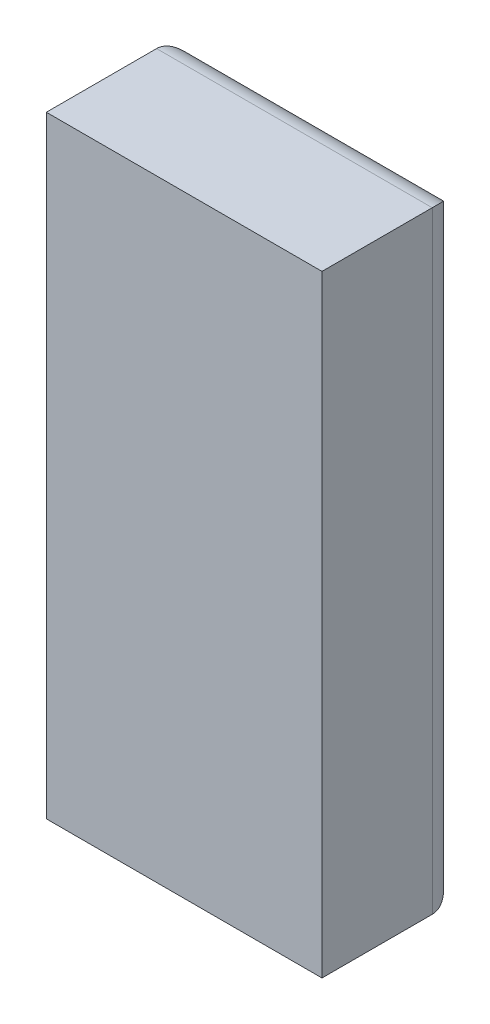
ISO-10303-21;
HEADER;
FILE_DESCRIPTION(('STEP AP214'),'2;1');
FILE_NAME('part.step','',(''),(''),'','','');
FILE_SCHEMA(('AUTOMOTIVE_DESIGN { 1 0 10303 214 1 1 1 1 }'));
ENDSEC;
DATA;
#1=APPLICATION_CONTEXT('core data for automotive mechanical design processes');
#2=APPLICATION_PROTOCOL_DEFINITION('international standard','automotive_design',2000,#1);
#3=PRODUCT_CONTEXT('',#1,'mechanical');
#4=PRODUCT('Part','Part','',(#3));
#5=PRODUCT_RELATED_PRODUCT_CATEGORY('part','',(#4));
#6=PRODUCT_DEFINITION_FORMATION('','',#4);
#7=PRODUCT_DEFINITION_CONTEXT('part definition',#1,'design');
#8=PRODUCT_DEFINITION('design','',#6,#7);
#9=PRODUCT_DEFINITION_SHAPE('','',#8);
#10=(LENGTH_UNIT() NAMED_UNIT(*) SI_UNIT(.MILLI.,.METRE.));
#11=(NAMED_UNIT(*) PLANE_ANGLE_UNIT() SI_UNIT($,.RADIAN.));
#12=(NAMED_UNIT(*) SI_UNIT($,.STERADIAN.) SOLID_ANGLE_UNIT());
#13=UNCERTAINTY_MEASURE_WITH_UNIT(LENGTH_MEASURE(1.E-05),#10,'distance_accuracy_value','');
#14=(GEOMETRIC_REPRESENTATION_CONTEXT(3) GLOBAL_UNCERTAINTY_ASSIGNED_CONTEXT((#13)) GLOBAL_UNIT_ASSIGNED_CONTEXT((#10,
#11,#12)) REPRESENTATION_CONTEXT('',''));
#15=CARTESIAN_POINT('',(0.,0.,0.));
#16=DIRECTION('',(0.,0.,1.));
#17=DIRECTION('',(1.,0.,0.));
#18=AXIS2_PLACEMENT_3D('',#15,#16,#17);
#19=CARTESIAN_POINT('',(50.,111.,-50.));
#20=DIRECTION('',(1.,0.,0.));
#21=DIRECTION('',(0.,1.,0.));
#22=AXIS2_PLACEMENT_3D('',#19,#20,#21);
#23=PLANE('',#22);
#24=DIRECTION('',(0.,0.,1.));
#25=VECTOR('',#24,1.);
#26=CARTESIAN_POINT('',(50.,-111.,-50.));
#27=LINE('',#26,#25);
#28=CARTESIAN_POINT('',(50.,-111.,-40.));
#29=VERTEX_POINT('',#28);
#30=CARTESIAN_POINT('',(50.,-111.,0.));
#31=VERTEX_POINT('',#30);
#32=EDGE_CURVE('E116',#29,#31,#27,.T.);
#33=ORIENTED_EDGE('',*,*,#32,.F.);
#34=DIRECTION('',(0.,1.,0.));
#35=VECTOR('',#34,1.);
#36=CARTESIAN_POINT('',(50.,111.,-40.));
#37=LINE('',#36,#35);
#38=CARTESIAN_POINT('',(50.,111.,-40.));
#39=VERTEX_POINT('',#38);
#40=EDGE_CURVE('E11',#29,#39,#37,.T.);
#41=ORIENTED_EDGE('',*,*,#40,.T.);
#42=DIRECTION('',(0.,0.,1.));
#43=VECTOR('',#42,1.);
#44=CARTESIAN_POINT('',(50.,111.,-50.));
#45=LINE('',#44,#43);
#46=CARTESIAN_POINT('',(50.,111.,0.));
#47=VERTEX_POINT('',#46);
#48=EDGE_CURVE('E88',#39,#47,#45,.T.);
#49=ORIENTED_EDGE('',*,*,#48,.T.);
#50=DIRECTION('',(0.,1.,0.));
#51=VECTOR('',#50,1.);
#52=CARTESIAN_POINT('',(50.,111.,0.));
#53=LINE('',#52,#51);
#54=EDGE_CURVE('E91',#31,#47,#53,.T.);
#55=ORIENTED_EDGE('',*,*,#54,.F.);
#56=EDGE_LOOP('',(#33,#41,#49,#55));
#57=FACE_BOUND('',#56,.T.);
#58=ADVANCED_FACE('F34',(#57),#23,.T.);
#59=CARTESIAN_POINT('',(-50.,-111.,-50.));
#60=DIRECTION('',(0.,-1.,0.));
#61=DIRECTION('',(0.,0.,-1.));
#62=AXIS2_PLACEMENT_3D('',#59,#60,#61);
#63=PLANE('',#62);
#64=DIRECTION('',(0.,0.,1.));
#65=VECTOR('',#64,1.);
#66=CARTESIAN_POINT('',(-50.,-111.,-50.));
#67=LINE('',#66,#65);
#68=CARTESIAN_POINT('',(-50.,-111.,-40.));
#69=VERTEX_POINT('',#68);
#70=CARTESIAN_POINT('',(-50.,-111.,0.));
#71=VERTEX_POINT('',#70);
#72=EDGE_CURVE('E119',#69,#71,#67,.T.);
#73=ORIENTED_EDGE('',*,*,#72,.F.);
#74=DIRECTION('',(1.,0.,0.));
#75=VECTOR('',#74,1.);
#76=CARTESIAN_POINT('',(50.,-111.,-40.));
#77=LINE('',#76,#75);
#78=EDGE_CURVE('E43',#69,#29,#77,.T.);
#79=ORIENTED_EDGE('',*,*,#78,.T.);
#80=ORIENTED_EDGE('',*,*,#32,.T.);
#81=DIRECTION('',(1.,0.,0.));
#82=VECTOR('',#81,1.);
#83=CARTESIAN_POINT('',(-50.,-111.,0.));
#84=LINE('',#83,#82);
#85=EDGE_CURVE('E98',#71,#31,#84,.T.);
#86=ORIENTED_EDGE('',*,*,#85,.F.);
#87=EDGE_LOOP('',(#73,#79,#80,#86));
#88=FACE_BOUND('',#87,.T.);
#89=ADVANCED_FACE('F154',(#88),#63,.T.);
#90=CARTESIAN_POINT('',(-50.,111.,-50.));
#91=DIRECTION('',(-1.,0.,0.));
#92=DIRECTION('',(0.,-1.,0.));
#93=AXIS2_PLACEMENT_3D('',#90,#91,#92);
#94=PLANE('',#93);
#95=DIRECTION('',(0.,0.,1.));
#96=VECTOR('',#95,1.);
#97=CARTESIAN_POINT('',(-50.,111.,-50.));
#98=LINE('',#97,#96);
#99=CARTESIAN_POINT('',(-50.,111.,-40.));
#100=VERTEX_POINT('',#99);
#101=CARTESIAN_POINT('',(-50.,111.,0.));
#102=VERTEX_POINT('',#101);
#103=EDGE_CURVE('E97',#100,#102,#98,.T.);
#104=ORIENTED_EDGE('',*,*,#103,.F.);
#105=DIRECTION('',(0.,-1.,0.));
#106=VECTOR('',#105,1.);
#107=CARTESIAN_POINT('',(-50.,-111.,-40.));
#108=LINE('',#107,#106);
#109=EDGE_CURVE('E58',#100,#69,#108,.T.);
#110=ORIENTED_EDGE('',*,*,#109,.T.);
#111=ORIENTED_EDGE('',*,*,#72,.T.);
#112=DIRECTION('',(0.,-1.,0.));
#113=VECTOR('',#112,1.);
#114=CARTESIAN_POINT('',(-50.,111.,0.));
#115=LINE('',#114,#113);
#116=EDGE_CURVE('E106',#102,#71,#115,.T.);
#117=ORIENTED_EDGE('',*,*,#116,.F.);
#118=EDGE_LOOP('',(#104,#110,#111,#117));
#119=FACE_BOUND('',#118,.T.);
#120=ADVANCED_FACE('F153',(#119),#94,.T.);
#121=CARTESIAN_POINT('',(-50.,111.,-50.));
#122=DIRECTION('',(0.,1.,0.));
#123=DIRECTION('',(0.,0.,1.));
#124=AXIS2_PLACEMENT_3D('',#121,#122,#123);
#125=PLANE('',#124);
#126=ORIENTED_EDGE('',*,*,#48,.F.);
#127=DIRECTION('',(-1.,0.,0.));
#128=VECTOR('',#127,1.);
#129=CARTESIAN_POINT('',(-50.,111.,-40.));
#130=LINE('',#129,#128);
#131=EDGE_CURVE('E118',#39,#100,#130,.T.);
#132=ORIENTED_EDGE('',*,*,#131,.T.);
#133=ORIENTED_EDGE('',*,*,#103,.T.);
#134=DIRECTION('',(-1.,0.,0.));
#135=VECTOR('',#134,1.);
#136=CARTESIAN_POINT('',(-50.,111.,0.));
#137=LINE('',#136,#135);
#138=EDGE_CURVE('E101',#47,#102,#137,.T.);
#139=ORIENTED_EDGE('',*,*,#138,.F.);
#140=EDGE_LOOP('',(#126,#132,#133,#139));
#141=FACE_BOUND('',#140,.T.);
#142=ADVANCED_FACE('F102',(#141),#125,.T.);
#143=CARTESIAN_POINT('',(0.,0.,-50.));
#144=DIRECTION('',(0.,0.,1.));
#145=DIRECTION('',(1.,0.,0.));
#146=AXIS2_PLACEMENT_3D('',#143,#144,#145);
#147=PLANE('',#146);
#148=DIRECTION('',(0.,-1.,0.));
#149=VECTOR('',#148,1.);
#150=CARTESIAN_POINT('',(-40.,111.,-50.));
#151=LINE('',#150,#149);
#152=CARTESIAN_POINT('',(-40.,-101.,-50.));
#153=VERTEX_POINT('',#152);
#154=CARTESIAN_POINT('',(-40.,101.,-50.));
#155=VERTEX_POINT('',#154);
#156=EDGE_CURVE('E127',#153,#155,#151,.F.);
#157=ORIENTED_EDGE('',*,*,#156,.T.);
#158=DIRECTION('',(-1.,0.,0.));
#159=VECTOR('',#158,1.);
#160=CARTESIAN_POINT('',(50.,101.,-50.));
#161=LINE('',#160,#159);
#162=CARTESIAN_POINT('',(40.,101.,-50.));
#163=VERTEX_POINT('',#162);
#164=EDGE_CURVE('E129',#155,#163,#161,.F.);
#165=ORIENTED_EDGE('',*,*,#164,.T.);
#166=DIRECTION('',(0.,1.,0.));
#167=VECTOR('',#166,1.);
#168=CARTESIAN_POINT('',(40.,-111.,-50.));
#169=LINE('',#168,#167);
#170=CARTESIAN_POINT('',(40.,-101.,-50.));
#171=VERTEX_POINT('',#170);
#172=EDGE_CURVE('E123',#163,#171,#169,.F.);
#173=ORIENTED_EDGE('',*,*,#172,.T.);
#174=DIRECTION('',(1.,0.,0.));
#175=VECTOR('',#174,1.);
#176=CARTESIAN_POINT('',(-50.,-101.,-50.));
#177=LINE('',#176,#175);
#178=EDGE_CURVE('E125',#171,#153,#177,.F.);
#179=ORIENTED_EDGE('',*,*,#178,.T.);
#180=EDGE_LOOP('',(#157,#165,#173,#179));
#181=FACE_BOUND('',#180,.T.);
#182=ADVANCED_FACE('F167',(#181),#147,.F.);
#183=CARTESIAN_POINT('',(0.,0.,0.));
#184=DIRECTION('',(0.,0.,1.));
#185=DIRECTION('',(1.,0.,0.));
#186=AXIS2_PLACEMENT_3D('',#183,#184,#185);
#187=PLANE('',#186);
#188=ORIENTED_EDGE('',*,*,#54,.T.);
#189=ORIENTED_EDGE('',*,*,#138,.T.);
#190=ORIENTED_EDGE('',*,*,#116,.T.);
#191=ORIENTED_EDGE('',*,*,#85,.T.);
#192=EDGE_LOOP('',(#188,#189,#190,#191));
#193=FACE_BOUND('',#192,.T.);
#194=ADVANCED_FACE('F108',(#193),#187,.T.);
#195=CARTESIAN_POINT('',(-50.,-101.,-40.));
#196=DIRECTION('',(-1.,0.,0.));
#197=DIRECTION('',(0.,0.,1.));
#198=AXIS2_PLACEMENT_3D('',#195,#196,#197);
#199=CYLINDRICAL_SURFACE('',#198,10.);
#200=CARTESIAN_POINT('',(-40.,-101.,-40.));
#201=DIRECTION('',(-0.707106781186548,0.707106781186547,0.));
#202=DIRECTION('',(-0.707106781186547,-0.707106781186548,0.));
#203=AXIS2_PLACEMENT_3D('',#200,#201,#202);
#204=ELLIPSE('',#203,14.1421356237309,10.);
#205=EDGE_CURVE('E112',#153,#69,#204,.T.);
#206=ORIENTED_EDGE('',*,*,#205,.F.);
#207=ORIENTED_EDGE('',*,*,#178,.F.);
#208=CARTESIAN_POINT('',(40.,-101.,-40.));
#209=DIRECTION('',(-0.707106781186547,-0.707106781186548,0.));
#210=DIRECTION('',(0.707106781186547,-0.707106781186547,0.));
#211=AXIS2_PLACEMENT_3D('',#208,#209,#210);
#212=ELLIPSE('',#211,14.142135623731,10.);
#213=EDGE_CURVE('E38',#29,#171,#212,.F.);
#214=ORIENTED_EDGE('',*,*,#213,.F.);
#215=ORIENTED_EDGE('',*,*,#78,.F.);
#216=EDGE_LOOP('',(#206,#207,#214,#215));
#217=FACE_BOUND('',#216,.T.);
#218=ADVANCED_FACE('F36',(#217),#199,.T.);
#219=CARTESIAN_POINT('',(40.,111.,-40.));
#220=DIRECTION('',(0.,-1.,0.));
#221=DIRECTION('',(1.,0.,0.));
#222=AXIS2_PLACEMENT_3D('',#219,#220,#221);
#223=CYLINDRICAL_SURFACE('',#222,10.);
#224=ORIENTED_EDGE('',*,*,#213,.T.);
#225=ORIENTED_EDGE('',*,*,#172,.F.);
#226=CARTESIAN_POINT('',(40.,101.,-40.));
#227=DIRECTION('',(0.707106781186547,-0.707106781186547,0.));
#228=DIRECTION('',(-0.707106781186547,-0.707106781186548,0.));
#229=AXIS2_PLACEMENT_3D('',#226,#227,#228);
#230=ELLIPSE('',#229,14.1421356237309,10.);
#231=EDGE_CURVE('E136',#39,#163,#230,.F.);
#232=ORIENTED_EDGE('',*,*,#231,.F.);
#233=ORIENTED_EDGE('',*,*,#40,.F.);
#234=EDGE_LOOP('',(#224,#225,#232,#233));
#235=FACE_BOUND('',#234,.T.);
#236=ADVANCED_FACE('F148',(#235),#223,.T.);
#237=CARTESIAN_POINT('',(-40.,111.,-40.));
#238=DIRECTION('',(0.,1.,0.));
#239=DIRECTION('',(-1.,0.,0.));
#240=AXIS2_PLACEMENT_3D('',#237,#238,#239);
#241=CYLINDRICAL_SURFACE('',#240,10.);
#242=ORIENTED_EDGE('',*,*,#205,.T.);
#243=ORIENTED_EDGE('',*,*,#109,.F.);
#244=CARTESIAN_POINT('',(-40.,101.,-40.));
#245=DIRECTION('',(0.707106781186547,0.707106781186548,0.));
#246=DIRECTION('',(-0.707106781186548,0.707106781186547,0.));
#247=AXIS2_PLACEMENT_3D('',#244,#245,#246);
#248=ELLIPSE('',#247,14.142135623731,10.);
#249=EDGE_CURVE('E134',#155,#100,#248,.T.);
#250=ORIENTED_EDGE('',*,*,#249,.F.);
#251=ORIENTED_EDGE('',*,*,#156,.F.);
#252=EDGE_LOOP('',(#242,#243,#250,#251));
#253=FACE_BOUND('',#252,.T.);
#254=ADVANCED_FACE('F141',(#253),#241,.T.);
#255=CARTESIAN_POINT('',(-50.,101.,-40.));
#256=DIRECTION('',(1.,0.,0.));
#257=DIRECTION('',(0.,0.,-1.));
#258=AXIS2_PLACEMENT_3D('',#255,#256,#257);
#259=CYLINDRICAL_SURFACE('',#258,10.);
#260=ORIENTED_EDGE('',*,*,#231,.T.);
#261=ORIENTED_EDGE('',*,*,#164,.F.);
#262=ORIENTED_EDGE('',*,*,#249,.T.);
#263=ORIENTED_EDGE('',*,*,#131,.F.);
#264=EDGE_LOOP('',(#260,#261,#262,#263));
#265=FACE_BOUND('',#264,.T.);
#266=ADVANCED_FACE('F152',(#265),#259,.T.);
#267=CLOSED_SHELL('',(#58,#89,#120,#142,#182,#194,#218,#236,#254,#266));
#268=MANIFOLD_SOLID_BREP('B2',#267);
#269=ADVANCED_BREP_SHAPE_REPRESENTATION('',(#18,#268),#14);
#270=SHAPE_DEFINITION_REPRESENTATION(#9,#269);
ENDSEC;
END-ISO-10303-21;
